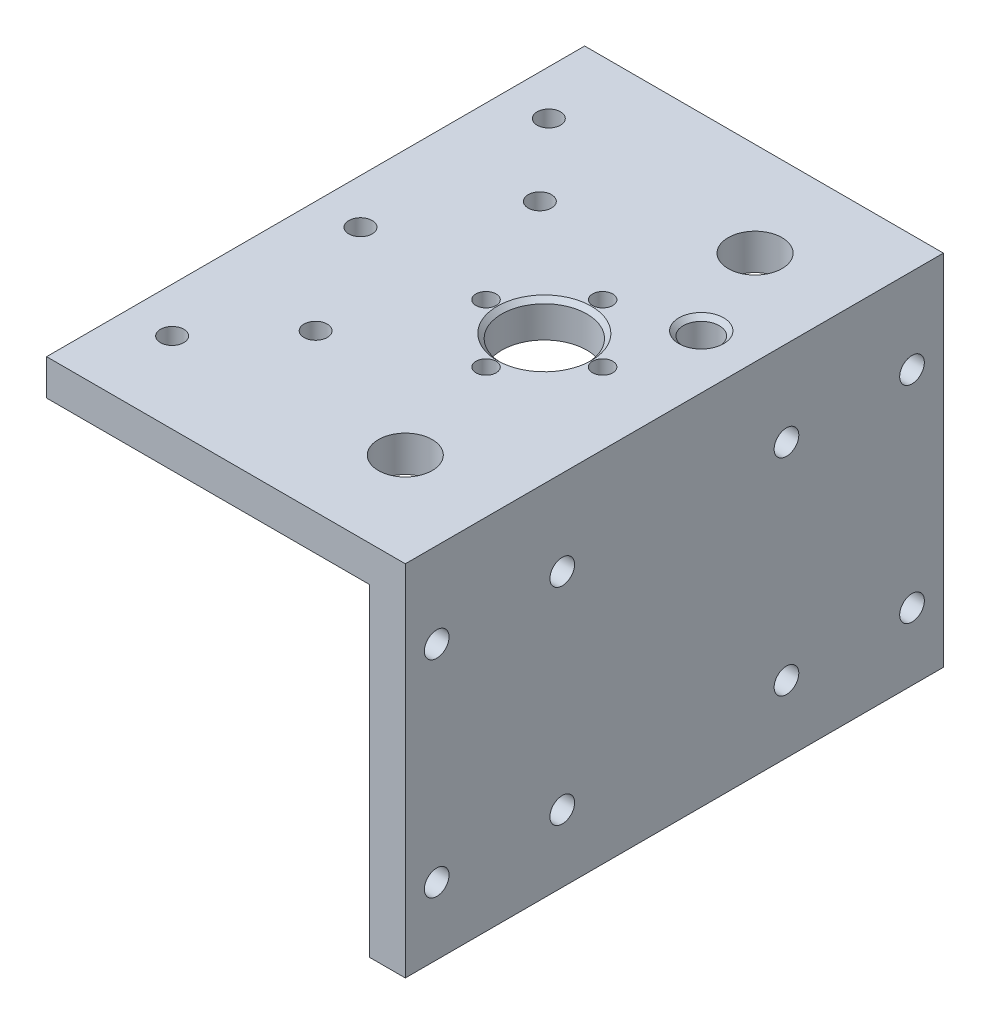
ISO-10303-21;
HEADER;
FILE_DESCRIPTION(('STEP AP214'),'2;1');
FILE_NAME('part.step','',(''),(''),'','','');
FILE_SCHEMA(('AUTOMOTIVE_DESIGN { 1 0 10303 214 1 1 1 1 }'));
ENDSEC;
DATA;
#1=APPLICATION_CONTEXT('core data for automotive mechanical design processes');
#2=APPLICATION_PROTOCOL_DEFINITION('international standard','automotive_design',2000,#1);
#3=PRODUCT_CONTEXT('',#1,'mechanical');
#4=PRODUCT('Part','Part','',(#3));
#5=PRODUCT_RELATED_PRODUCT_CATEGORY('part','',(#4));
#6=PRODUCT_DEFINITION_FORMATION('','',#4);
#7=PRODUCT_DEFINITION_CONTEXT('part definition',#1,'design');
#8=PRODUCT_DEFINITION('design','',#6,#7);
#9=PRODUCT_DEFINITION_SHAPE('','',#8);
#10=(LENGTH_UNIT() NAMED_UNIT(*) SI_UNIT(.MILLI.,.METRE.));
#11=(NAMED_UNIT(*) PLANE_ANGLE_UNIT() SI_UNIT($,.RADIAN.));
#12=(NAMED_UNIT(*) SI_UNIT($,.STERADIAN.) SOLID_ANGLE_UNIT());
#13=UNCERTAINTY_MEASURE_WITH_UNIT(LENGTH_MEASURE(1.E-05),#10,'distance_accuracy_value','');
#14=(GEOMETRIC_REPRESENTATION_CONTEXT(3) GLOBAL_UNCERTAINTY_ASSIGNED_CONTEXT((#13)) GLOBAL_UNIT_ASSIGNED_CONTEXT((#10,
#11,#12)) REPRESENTATION_CONTEXT('',''));
#15=CARTESIAN_POINT('',(0.,0.,0.));
#16=DIRECTION('',(0.,0.,1.));
#17=DIRECTION('',(1.,0.,0.));
#18=AXIS2_PLACEMENT_3D('',#15,#16,#17);
#19=CARTESIAN_POINT('',(0.,-80.,120.));
#20=DIRECTION('',(-1.,0.,0.));
#21=DIRECTION('',(0.,0.,1.));
#22=AXIS2_PLACEMENT_3D('',#19,#20,#21);
#23=PLANE('',#22);
#24=CARTESIAN_POINT('',(0.,-65.,34.9999999999999));
#25=DIRECTION('',(1.,0.,0.));
#26=DIRECTION('',(0.,0.,1.));
#27=AXIS2_PLACEMENT_3D('',#24,#25,#26);
#28=CIRCLE('',#27,2.75);
#29=CARTESIAN_POINT('',(0.,-65.,37.7499999999999));
#30=VERTEX_POINT('',#29);
#31=EDGE_CURVE('E183',#30,#30,#28,.T.);
#32=ORIENTED_EDGE('',*,*,#31,.F.);
#33=EDGE_LOOP('',(#32));
#34=FACE_BOUND('',#33,.T.);
#35=CARTESIAN_POINT('',(0.,-65.,7.00000000000011));
#36=DIRECTION('',(1.,0.,0.));
#37=DIRECTION('',(0.,0.,-1.));
#38=AXIS2_PLACEMENT_3D('',#35,#36,#37);
#39=CIRCLE('',#38,2.75);
#40=CARTESIAN_POINT('',(0.,-65.,4.25000000000011));
#41=VERTEX_POINT('',#40);
#42=EDGE_CURVE('E179',#41,#41,#39,.T.);
#43=ORIENTED_EDGE('',*,*,#42,.F.);
#44=EDGE_LOOP('',(#43));
#45=FACE_BOUND('',#44,.T.);
#46=CARTESIAN_POINT('',(0.,-65.,113.));
#47=DIRECTION('',(1.,0.,0.));
#48=DIRECTION('',(0.,0.,1.));
#49=AXIS2_PLACEMENT_3D('',#46,#47,#48);
#50=CIRCLE('',#49,2.75000000000001);
#51=CARTESIAN_POINT('',(0.,-65.,115.75));
#52=VERTEX_POINT('',#51);
#53=EDGE_CURVE('E175',#52,#52,#50,.T.);
#54=ORIENTED_EDGE('',*,*,#53,.F.);
#55=EDGE_LOOP('',(#54));
#56=FACE_BOUND('',#55,.T.);
#57=CARTESIAN_POINT('',(0.,-65.,85.0000000000001));
#58=DIRECTION('',(1.,0.,0.));
#59=DIRECTION('',(0.,0.,-1.));
#60=AXIS2_PLACEMENT_3D('',#57,#58,#59);
#61=CIRCLE('',#60,2.75000000000001);
#62=CARTESIAN_POINT('',(0.,-65.,82.2500000000001));
#63=VERTEX_POINT('',#62);
#64=EDGE_CURVE('E171',#63,#63,#61,.T.);
#65=ORIENTED_EDGE('',*,*,#64,.F.);
#66=EDGE_LOOP('',(#65));
#67=FACE_BOUND('',#66,.T.);
#68=CARTESIAN_POINT('',(0.,-19.,7.00000000000001));
#69=DIRECTION('',(1.,0.,0.));
#70=DIRECTION('',(0.,0.,1.));
#71=AXIS2_PLACEMENT_3D('',#68,#69,#70);
#72=CIRCLE('',#71,2.75);
#73=CARTESIAN_POINT('',(0.,-19.,9.75));
#74=VERTEX_POINT('',#73);
#75=EDGE_CURVE('E167',#74,#74,#72,.T.);
#76=ORIENTED_EDGE('',*,*,#75,.F.);
#77=EDGE_LOOP('',(#76));
#78=FACE_BOUND('',#77,.T.);
#79=CARTESIAN_POINT('',(0.,-19.,35.));
#80=DIRECTION('',(1.,0.,0.));
#81=DIRECTION('',(0.,0.,-1.));
#82=AXIS2_PLACEMENT_3D('',#79,#80,#81);
#83=CIRCLE('',#82,2.74999999999999);
#84=CARTESIAN_POINT('',(0.,-19.,32.25));
#85=VERTEX_POINT('',#84);
#86=EDGE_CURVE('E163',#85,#85,#83,.T.);
#87=ORIENTED_EDGE('',*,*,#86,.F.);
#88=EDGE_LOOP('',(#87));
#89=FACE_BOUND('',#88,.T.);
#90=CARTESIAN_POINT('',(0.,-19.,113.));
#91=DIRECTION('',(1.,0.,0.));
#92=DIRECTION('',(0.,0.,-1.));
#93=AXIS2_PLACEMENT_3D('',#90,#91,#92);
#94=CIRCLE('',#93,2.75000000000001);
#95=CARTESIAN_POINT('',(0.,-19.,110.25));
#96=VERTEX_POINT('',#95);
#97=EDGE_CURVE('E159',#96,#96,#94,.T.);
#98=ORIENTED_EDGE('',*,*,#97,.F.);
#99=EDGE_LOOP('',(#98));
#100=FACE_BOUND('',#99,.T.);
#101=CARTESIAN_POINT('',(0.,-19.,85.));
#102=DIRECTION('',(1.,0.,0.));
#103=DIRECTION('',(0.,0.,1.));
#104=AXIS2_PLACEMENT_3D('',#101,#102,#103);
#105=CIRCLE('',#104,2.75000000000001);
#106=CARTESIAN_POINT('',(0.,-19.,87.75));
#107=VERTEX_POINT('',#106);
#108=EDGE_CURVE('E155',#107,#107,#105,.T.);
#109=ORIENTED_EDGE('',*,*,#108,.F.);
#110=EDGE_LOOP('',(#109));
#111=FACE_BOUND('',#110,.T.);
#112=DIRECTION('',(0.,1.,0.));
#113=VECTOR('',#112,1.);
#114=CARTESIAN_POINT('',(0.,-80.,0.));
#115=LINE('',#114,#113);
#116=CARTESIAN_POINT('',(0.,-80.,0.));
#117=VERTEX_POINT('',#116);
#118=CARTESIAN_POINT('',(0.,0.,0.));
#119=VERTEX_POINT('',#118);
#120=EDGE_CURVE('E123',#117,#119,#115,.T.);
#121=ORIENTED_EDGE('',*,*,#120,.T.);
#122=DIRECTION('',(0.,0.,-1.));
#123=VECTOR('',#122,1.);
#124=CARTESIAN_POINT('',(0.,0.,120.));
#125=LINE('',#124,#123);
#126=CARTESIAN_POINT('',(0.,0.,120.));
#127=VERTEX_POINT('',#126);
#128=EDGE_CURVE('E144',#127,#119,#125,.T.);
#129=ORIENTED_EDGE('',*,*,#128,.F.);
#130=DIRECTION('',(0.,1.,0.));
#131=VECTOR('',#130,1.);
#132=CARTESIAN_POINT('',(0.,-80.,120.));
#133=LINE('',#132,#131);
#134=CARTESIAN_POINT('',(0.,-80.,120.));
#135=VERTEX_POINT('',#134);
#136=EDGE_CURVE('E137',#135,#127,#133,.T.);
#137=ORIENTED_EDGE('',*,*,#136,.F.);
#138=DIRECTION('',(0.,0.,-1.));
#139=VECTOR('',#138,1.);
#140=CARTESIAN_POINT('',(0.,-80.,120.));
#141=LINE('',#140,#139);
#142=EDGE_CURVE('E119',#135,#117,#141,.T.);
#143=ORIENTED_EDGE('',*,*,#142,.T.);
#144=EDGE_LOOP('',(#121,#129,#137,#143));
#145=FACE_BOUND('',#144,.T.);
#146=ADVANCED_FACE('F33',(#34,#45,#56,#67,#78,#89,#100,#111,#145),#23,.F.);
#147=CARTESIAN_POINT('',(0.,0.,120.));
#148=DIRECTION('',(0.,-1.,0.));
#149=DIRECTION('',(1.,0.,0.));
#150=AXIS2_PLACEMENT_3D('',#147,#148,#149);
#151=PLANE('',#150);
#152=CARTESIAN_POINT('',(-29.,0.,60.));
#153=DIRECTION('',(0.,-1.,0.));
#154=DIRECTION('',(1.,0.,0.));
#155=AXIS2_PLACEMENT_3D('',#152,#153,#154);
#156=CIRCLE('',#155,10.5);
#157=CARTESIAN_POINT('',(-18.5,0.,60.));
#158=VERTEX_POINT('',#157);
#159=EDGE_CURVE('E11',#158,#158,#156,.T.);
#160=ORIENTED_EDGE('',*,*,#159,.T.);
#161=EDGE_LOOP('',(#160));
#162=FACE_BOUND('',#161,.T.);
#163=CARTESIAN_POINT('',(-12.,0.,42.));
#164=DIRECTION('',(0.,-1.,0.));
#165=DIRECTION('',(1.,0.,0.));
#166=AXIS2_PLACEMENT_3D('',#163,#164,#165);
#167=CIRCLE('',#166,5.00000000000003);
#168=CARTESIAN_POINT('',(-6.99999999999997,0.,42.));
#169=VERTEX_POINT('',#168);
#170=EDGE_CURVE('E206',#169,#169,#167,.T.);
#171=ORIENTED_EDGE('',*,*,#170,.T.);
#172=EDGE_LOOP('',(#171));
#173=FACE_BOUND('',#172,.T.);
#174=CARTESIAN_POINT('',(-55.,0.,85.));
#175=DIRECTION('',(0.,1.,0.));
#176=DIRECTION('',(-1.,0.,0.));
#177=AXIS2_PLACEMENT_3D('',#174,#175,#176);
#178=CIRCLE('',#177,2.6);
#179=CARTESIAN_POINT('',(-57.6,0.,85.));
#180=VERTEX_POINT('',#179);
#181=EDGE_CURVE('E203',#180,#180,#178,.T.);
#182=ORIENTED_EDGE('',*,*,#181,.F.);
#183=EDGE_LOOP('',(#182));
#184=FACE_BOUND('',#183,.T.);
#185=CARTESIAN_POINT('',(-55.,0.,35.));
#186=DIRECTION('',(0.,1.,0.));
#187=DIRECTION('',(-1.,0.,0.));
#188=AXIS2_PLACEMENT_3D('',#185,#186,#187);
#189=CIRCLE('',#188,2.6);
#190=CARTESIAN_POINT('',(-57.6,0.,35.));
#191=VERTEX_POINT('',#190);
#192=EDGE_CURVE('E199',#191,#191,#189,.T.);
#193=ORIENTED_EDGE('',*,*,#192,.F.);
#194=EDGE_LOOP('',(#193));
#195=FACE_BOUND('',#194,.T.);
#196=CARTESIAN_POINT('',(-70.,0.,102.));
#197=DIRECTION('',(0.,1.,0.));
#198=DIRECTION('',(-1.,0.,0.));
#199=AXIS2_PLACEMENT_3D('',#196,#197,#198);
#200=CIRCLE('',#199,2.6);
#201=CARTESIAN_POINT('',(-72.6,0.,102.));
#202=VERTEX_POINT('',#201);
#203=EDGE_CURVE('E195',#202,#202,#200,.T.);
#204=ORIENTED_EDGE('',*,*,#203,.F.);
#205=EDGE_LOOP('',(#204));
#206=FACE_BOUND('',#205,.T.);
#207=CARTESIAN_POINT('',(-70.,0.,60.));
#208=DIRECTION('',(0.,1.,0.));
#209=DIRECTION('',(-1.,0.,0.));
#210=AXIS2_PLACEMENT_3D('',#207,#208,#209);
#211=CIRCLE('',#210,2.6);
#212=CARTESIAN_POINT('',(-72.6,0.,60.));
#213=VERTEX_POINT('',#212);
#214=EDGE_CURVE('E191',#213,#213,#211,.T.);
#215=ORIENTED_EDGE('',*,*,#214,.F.);
#216=EDGE_LOOP('',(#215));
#217=FACE_BOUND('',#216,.T.);
#218=CARTESIAN_POINT('',(-70.,0.,18.));
#219=DIRECTION('',(0.,1.,0.));
#220=DIRECTION('',(-1.,0.,0.));
#221=AXIS2_PLACEMENT_3D('',#218,#219,#220);
#222=CIRCLE('',#221,2.6);
#223=CARTESIAN_POINT('',(-72.6,0.,18.));
#224=VERTEX_POINT('',#223);
#225=EDGE_CURVE('E187',#224,#224,#222,.T.);
#226=ORIENTED_EDGE('',*,*,#225,.F.);
#227=EDGE_LOOP('',(#226));
#228=FACE_BOUND('',#227,.T.);
#229=CARTESIAN_POINT('',(-29.,0.,47.));
#230=DIRECTION('',(0.,1.,0.));
#231=DIRECTION('',(0.,0.,1.));
#232=AXIS2_PLACEMENT_3D('',#229,#230,#231);
#233=CIRCLE('',#232,2.24999999999999);
#234=CARTESIAN_POINT('',(-29.,0.,49.25));
#235=VERTEX_POINT('',#234);
#236=EDGE_CURVE('E151',#235,#235,#233,.T.);
#237=ORIENTED_EDGE('',*,*,#236,.F.);
#238=EDGE_LOOP('',(#237));
#239=FACE_BOUND('',#238,.T.);
#240=CARTESIAN_POINT('',(-42.,0.,60.));
#241=DIRECTION('',(0.,1.,0.));
#242=DIRECTION('',(0.,0.,1.));
#243=AXIS2_PLACEMENT_3D('',#240,#241,#242);
#244=CIRCLE('',#243,2.24999999999999);
#245=CARTESIAN_POINT('',(-42.,0.,62.25));
#246=VERTEX_POINT('',#245);
#247=EDGE_CURVE('E150',#246,#246,#244,.T.);
#248=ORIENTED_EDGE('',*,*,#247,.F.);
#249=EDGE_LOOP('',(#248));
#250=FACE_BOUND('',#249,.T.);
#251=CARTESIAN_POINT('',(-29.,0.,73.));
#252=DIRECTION('',(0.,1.,0.));
#253=DIRECTION('',(0.,0.,1.));
#254=AXIS2_PLACEMENT_3D('',#251,#252,#253);
#255=CIRCLE('',#254,2.24999999999999);
#256=CARTESIAN_POINT('',(-29.,0.,75.25));
#257=VERTEX_POINT('',#256);
#258=EDGE_CURVE('E399',#257,#257,#255,.T.);
#259=ORIENTED_EDGE('',*,*,#258,.F.);
#260=EDGE_LOOP('',(#259));
#261=FACE_BOUND('',#260,.T.);
#262=CARTESIAN_POINT('',(-16.,0.,60.));
#263=DIRECTION('',(0.,1.,0.));
#264=DIRECTION('',(0.,0.,1.));
#265=AXIS2_PLACEMENT_3D('',#262,#263,#264);
#266=CIRCLE('',#265,2.24999999999999);
#267=CARTESIAN_POINT('',(-16.,0.,62.25));
#268=VERTEX_POINT('',#267);
#269=EDGE_CURVE('E395',#268,#268,#266,.T.);
#270=ORIENTED_EDGE('',*,*,#269,.F.);
#271=EDGE_LOOP('',(#270));
#272=FACE_BOUND('',#271,.T.);
#273=CARTESIAN_POINT('',(-21.,0.,99.));
#274=DIRECTION('',(0.,1.,0.));
#275=DIRECTION('',(-1.,0.,0.));
#276=AXIS2_PLACEMENT_3D('',#273,#274,#275);
#277=CIRCLE('',#276,6.);
#278=CARTESIAN_POINT('',(-27.,0.,99.));
#279=VERTEX_POINT('',#278);
#280=EDGE_CURVE('E389',#279,#279,#277,.T.);
#281=ORIENTED_EDGE('',*,*,#280,.F.);
#282=EDGE_LOOP('',(#281));
#283=FACE_BOUND('',#282,.T.);
#284=CARTESIAN_POINT('',(-21.,0.,21.));
#285=DIRECTION('',(0.,1.,0.));
#286=DIRECTION('',(-1.,0.,0.));
#287=AXIS2_PLACEMENT_3D('',#284,#285,#286);
#288=CIRCLE('',#287,6.);
#289=CARTESIAN_POINT('',(-27.,0.,21.));
#290=VERTEX_POINT('',#289);
#291=EDGE_CURVE('E374',#290,#290,#288,.T.);
#292=ORIENTED_EDGE('',*,*,#291,.F.);
#293=EDGE_LOOP('',(#292));
#294=FACE_BOUND('',#293,.T.);
#295=DIRECTION('',(-1.,0.,0.));
#296=VECTOR('',#295,1.);
#297=CARTESIAN_POINT('',(0.,0.,0.));
#298=LINE('',#297,#296);
#299=CARTESIAN_POINT('',(-80.,0.,0.));
#300=VERTEX_POINT('',#299);
#301=EDGE_CURVE('E126',#119,#300,#298,.T.);
#302=ORIENTED_EDGE('',*,*,#301,.T.);
#303=DIRECTION('',(0.,0.,-1.));
#304=VECTOR('',#303,1.);
#305=CARTESIAN_POINT('',(-80.,0.,120.));
#306=LINE('',#305,#304);
#307=CARTESIAN_POINT('',(-80.,0.,120.));
#308=VERTEX_POINT('',#307);
#309=EDGE_CURVE('E141',#308,#300,#306,.T.);
#310=ORIENTED_EDGE('',*,*,#309,.F.);
#311=DIRECTION('',(-1.,0.,0.));
#312=VECTOR('',#311,1.);
#313=CARTESIAN_POINT('',(0.,0.,120.));
#314=LINE('',#313,#312);
#315=EDGE_CURVE('E89',#127,#308,#314,.T.);
#316=ORIENTED_EDGE('',*,*,#315,.F.);
#317=ORIENTED_EDGE('',*,*,#128,.T.);
#318=EDGE_LOOP('',(#302,#310,#316,#317));
#319=FACE_BOUND('',#318,.T.);
#320=ADVANCED_FACE('F224',(#162,#173,#184,#195,#206,#217,#228,#239,#250,#261,#272,#283,#294,
#319),#151,.F.);
#321=CARTESIAN_POINT('',(-80.,0.,120.));
#322=DIRECTION('',(1.,0.,0.));
#323=DIRECTION('',(0.,0.,-1.));
#324=AXIS2_PLACEMENT_3D('',#321,#322,#323);
#325=PLANE('',#324);
#326=DIRECTION('',(0.,-1.,0.));
#327=VECTOR('',#326,1.);
#328=CARTESIAN_POINT('',(-80.,0.,0.));
#329=LINE('',#328,#327);
#330=CARTESIAN_POINT('',(-80.,-8.00000000000001,0.));
#331=VERTEX_POINT('',#330);
#332=EDGE_CURVE('E129',#300,#331,#329,.T.);
#333=ORIENTED_EDGE('',*,*,#332,.T.);
#334=DIRECTION('',(0.,0.,-1.));
#335=VECTOR('',#334,1.);
#336=CARTESIAN_POINT('',(-80.,-8.00000000000001,120.));
#337=LINE('',#336,#335);
#338=CARTESIAN_POINT('',(-80.,-8.00000000000001,120.));
#339=VERTEX_POINT('',#338);
#340=EDGE_CURVE('E113',#339,#331,#337,.T.);
#341=ORIENTED_EDGE('',*,*,#340,.F.);
#342=DIRECTION('',(0.,-1.,0.));
#343=VECTOR('',#342,1.);
#344=CARTESIAN_POINT('',(-80.,0.,120.));
#345=LINE('',#344,#343);
#346=EDGE_CURVE('E103',#308,#339,#345,.T.);
#347=ORIENTED_EDGE('',*,*,#346,.F.);
#348=ORIENTED_EDGE('',*,*,#309,.T.);
#349=EDGE_LOOP('',(#333,#341,#347,#348));
#350=FACE_BOUND('',#349,.T.);
#351=ADVANCED_FACE('F230',(#350),#325,.F.);
#352=CARTESIAN_POINT('',(-80.,-8.00000000000001,120.));
#353=DIRECTION('',(0.,1.,0.));
#354=DIRECTION('',(0.,0.,1.));
#355=AXIS2_PLACEMENT_3D('',#352,#353,#354);
#356=PLANE('',#355);
#357=CARTESIAN_POINT('',(-55.,-8.00000000000001,85.));
#358=DIRECTION('',(0.,1.,0.));
#359=DIRECTION('',(0.,0.,1.));
#360=AXIS2_PLACEMENT_3D('',#357,#358,#359);
#361=CIRCLE('',#360,2.6);
#362=CARTESIAN_POINT('',(-55.,-8.00000000000001,87.6));
#363=VERTEX_POINT('',#362);
#364=EDGE_CURVE('E200',#363,#363,#361,.T.);
#365=ORIENTED_EDGE('',*,*,#364,.T.);
#366=EDGE_LOOP('',(#365));
#367=FACE_BOUND('',#366,.T.);
#368=CARTESIAN_POINT('',(-55.,-8.00000000000001,35.));
#369=DIRECTION('',(0.,1.,0.));
#370=DIRECTION('',(0.,0.,1.));
#371=AXIS2_PLACEMENT_3D('',#368,#369,#370);
#372=CIRCLE('',#371,2.6);
#373=CARTESIAN_POINT('',(-55.,-8.00000000000001,37.6));
#374=VERTEX_POINT('',#373);
#375=EDGE_CURVE('E196',#374,#374,#372,.T.);
#376=ORIENTED_EDGE('',*,*,#375,.T.);
#377=EDGE_LOOP('',(#376));
#378=FACE_BOUND('',#377,.T.);
#379=CARTESIAN_POINT('',(-70.,-8.00000000000001,102.));
#380=DIRECTION('',(0.,1.,0.));
#381=DIRECTION('',(0.,0.,1.));
#382=AXIS2_PLACEMENT_3D('',#379,#380,#381);
#383=CIRCLE('',#382,2.6);
#384=CARTESIAN_POINT('',(-70.,-8.00000000000001,104.6));
#385=VERTEX_POINT('',#384);
#386=EDGE_CURVE('E192',#385,#385,#383,.T.);
#387=ORIENTED_EDGE('',*,*,#386,.T.);
#388=EDGE_LOOP('',(#387));
#389=FACE_BOUND('',#388,.T.);
#390=CARTESIAN_POINT('',(-70.,-8.00000000000001,60.));
#391=DIRECTION('',(0.,1.,0.));
#392=DIRECTION('',(0.,0.,1.));
#393=AXIS2_PLACEMENT_3D('',#390,#391,#392);
#394=CIRCLE('',#393,2.6);
#395=CARTESIAN_POINT('',(-70.,-8.00000000000001,62.6));
#396=VERTEX_POINT('',#395);
#397=EDGE_CURVE('E188',#396,#396,#394,.T.);
#398=ORIENTED_EDGE('',*,*,#397,.T.);
#399=EDGE_LOOP('',(#398));
#400=FACE_BOUND('',#399,.T.);
#401=CARTESIAN_POINT('',(-70.,-8.00000000000001,18.));
#402=DIRECTION('',(0.,1.,0.));
#403=DIRECTION('',(0.,0.,1.));
#404=AXIS2_PLACEMENT_3D('',#401,#402,#403);
#405=CIRCLE('',#404,2.6);
#406=CARTESIAN_POINT('',(-70.,-8.00000000000001,20.6));
#407=VERTEX_POINT('',#406);
#408=EDGE_CURVE('E184',#407,#407,#405,.T.);
#409=ORIENTED_EDGE('',*,*,#408,.T.);
#410=EDGE_LOOP('',(#409));
#411=FACE_BOUND('',#410,.T.);
#412=CARTESIAN_POINT('',(-29.,-8.00000000000001,47.));
#413=DIRECTION('',(0.,1.,0.));
#414=DIRECTION('',(0.,0.,1.));
#415=AXIS2_PLACEMENT_3D('',#412,#413,#414);
#416=CIRCLE('',#415,2.24999999999999);
#417=CARTESIAN_POINT('',(-29.,-8.00000000000001,49.25));
#418=VERTEX_POINT('',#417);
#419=EDGE_CURVE('E147',#418,#418,#416,.T.);
#420=ORIENTED_EDGE('',*,*,#419,.T.);
#421=EDGE_LOOP('',(#420));
#422=FACE_BOUND('',#421,.T.);
#423=CARTESIAN_POINT('',(-42.,-8.00000000000001,60.));
#424=DIRECTION('',(0.,1.,0.));
#425=DIRECTION('',(0.,0.,1.));
#426=AXIS2_PLACEMENT_3D('',#423,#424,#425);
#427=CIRCLE('',#426,2.24999999999999);
#428=CARTESIAN_POINT('',(-42.,-8.00000000000001,62.25));
#429=VERTEX_POINT('',#428);
#430=EDGE_CURVE('E354',#429,#429,#427,.T.);
#431=ORIENTED_EDGE('',*,*,#430,.T.);
#432=EDGE_LOOP('',(#431));
#433=FACE_BOUND('',#432,.T.);
#434=CARTESIAN_POINT('',(-29.,-8.00000000000001,73.));
#435=DIRECTION('',(0.,1.,0.));
#436=DIRECTION('',(0.,0.,1.));
#437=AXIS2_PLACEMENT_3D('',#434,#435,#436);
#438=CIRCLE('',#437,2.24999999999999);
#439=CARTESIAN_POINT('',(-29.,-8.00000000000001,75.25));
#440=VERTEX_POINT('',#439);
#441=EDGE_CURVE('E358',#440,#440,#438,.T.);
#442=ORIENTED_EDGE('',*,*,#441,.T.);
#443=EDGE_LOOP('',(#442));
#444=FACE_BOUND('',#443,.T.);
#445=CARTESIAN_POINT('',(-16.,-8.00000000000001,60.));
#446=DIRECTION('',(0.,1.,0.));
#447=DIRECTION('',(0.,0.,1.));
#448=AXIS2_PLACEMENT_3D('',#445,#446,#447);
#449=CIRCLE('',#448,2.24999999999999);
#450=CARTESIAN_POINT('',(-16.,-8.00000000000001,62.25));
#451=VERTEX_POINT('',#450);
#452=EDGE_CURVE('E362',#451,#451,#449,.T.);
#453=ORIENTED_EDGE('',*,*,#452,.T.);
#454=EDGE_LOOP('',(#453));
#455=FACE_BOUND('',#454,.T.);
#456=CARTESIAN_POINT('',(-29.,-8.00000000000001,60.));
#457=DIRECTION('',(0.,1.,0.));
#458=DIRECTION('',(0.,0.,1.));
#459=AXIS2_PLACEMENT_3D('',#456,#457,#458);
#460=CIRCLE('',#459,9.5);
#461=CARTESIAN_POINT('',(-29.,-8.00000000000001,69.5));
#462=VERTEX_POINT('',#461);
#463=EDGE_CURVE('E366',#462,#462,#460,.F.);
#464=ORIENTED_EDGE('',*,*,#463,.F.);
#465=EDGE_LOOP('',(#464));
#466=FACE_BOUND('',#465,.T.);
#467=CARTESIAN_POINT('',(-21.,-8.00000000000001,99.));
#468=DIRECTION('',(0.,1.,0.));
#469=DIRECTION('',(0.,0.,1.));
#470=AXIS2_PLACEMENT_3D('',#467,#468,#469);
#471=CIRCLE('',#470,6.);
#472=CARTESIAN_POINT('',(-21.,-8.00000000000001,105.));
#473=VERTEX_POINT('',#472);
#474=EDGE_CURVE('E370',#473,#473,#471,.F.);
#475=ORIENTED_EDGE('',*,*,#474,.F.);
#476=EDGE_LOOP('',(#475));
#477=FACE_BOUND('',#476,.T.);
#478=CARTESIAN_POINT('',(-21.,-8.00000000000001,21.));
#479=DIRECTION('',(0.,1.,0.));
#480=DIRECTION('',(0.,0.,1.));
#481=AXIS2_PLACEMENT_3D('',#478,#479,#480);
#482=CIRCLE('',#481,6.);
#483=CARTESIAN_POINT('',(-21.,-8.00000000000001,27.));
#484=VERTEX_POINT('',#483);
#485=EDGE_CURVE('E127',#484,#484,#482,.F.);
#486=ORIENTED_EDGE('',*,*,#485,.F.);
#487=EDGE_LOOP('',(#486));
#488=FACE_BOUND('',#487,.T.);
#489=DIRECTION('',(0.,0.,-1.));
#490=VECTOR('',#489,1.);
#491=CARTESIAN_POINT('',(-8.00000000000001,-8.00000000000001,120.));
#492=LINE('',#491,#490);
#493=CARTESIAN_POINT('',(-8.00000000000001,-8.00000000000001,42.));
#494=VERTEX_POINT('',#493);
#495=CARTESIAN_POINT('',(-8.00000000000001,-8.00000000000001,0.));
#496=VERTEX_POINT('',#495);
#497=EDGE_CURVE('E114',#494,#496,#492,.T.);
#498=ORIENTED_EDGE('',*,*,#497,.F.);
#499=CARTESIAN_POINT('',(-12.,-8.00000000000001,42.));
#500=DIRECTION('',(0.,1.,0.));
#501=DIRECTION('',(0.,0.,1.));
#502=AXIS2_PLACEMENT_3D('',#499,#500,#501);
#503=CIRCLE('',#502,4.00000000000001);
#504=EDGE_CURVE('E46',#494,#494,#503,.F.);
#505=ORIENTED_EDGE('',*,*,#504,.F.);
#506=CARTESIAN_POINT('',(-8.00000000000001,-8.00000000000001,120.));
#507=VERTEX_POINT('',#506);
#508=EDGE_CURVE('E109',#507,#494,#492,.T.);
#509=ORIENTED_EDGE('',*,*,#508,.F.);
#510=DIRECTION('',(1.,0.,0.));
#511=VECTOR('',#510,1.);
#512=CARTESIAN_POINT('',(-80.,-8.00000000000001,120.));
#513=LINE('',#512,#511);
#514=EDGE_CURVE('E96',#339,#507,#513,.T.);
#515=ORIENTED_EDGE('',*,*,#514,.F.);
#516=ORIENTED_EDGE('',*,*,#340,.T.);
#517=DIRECTION('',(1.,0.,0.));
#518=VECTOR('',#517,1.);
#519=CARTESIAN_POINT('',(-80.,-8.00000000000001,0.));
#520=LINE('',#519,#518);
#521=EDGE_CURVE('E131',#331,#496,#520,.T.);
#522=ORIENTED_EDGE('',*,*,#521,.T.);
#523=EDGE_LOOP('',(#498,#505,#509,#515,#516,#522));
#524=FACE_BOUND('',#523,.T.);
#525=ADVANCED_FACE('F111',(#367,#378,#389,#400,#411,#422,#433,#444,#455,#466,#477,#488,#524),
#356,.F.);
#526=CARTESIAN_POINT('',(-8.00000000000001,-8.00000000000001,120.));
#527=DIRECTION('',(1.,0.,0.));
#528=DIRECTION('',(0.,1.,0.));
#529=AXIS2_PLACEMENT_3D('',#526,#527,#528);
#530=PLANE('',#529);
#531=CARTESIAN_POINT('',(-8.,-65.,34.9999999999999));
#532=DIRECTION('',(1.,0.,0.));
#533=DIRECTION('',(0.,1.,0.));
#534=AXIS2_PLACEMENT_3D('',#531,#532,#533);
#535=CIRCLE('',#534,2.75);
#536=CARTESIAN_POINT('',(-8.,-62.25,34.9999999999999));
#537=VERTEX_POINT('',#536);
#538=EDGE_CURVE('E180',#537,#537,#535,.T.);
#539=ORIENTED_EDGE('',*,*,#538,.T.);
#540=EDGE_LOOP('',(#539));
#541=FACE_BOUND('',#540,.T.);
#542=CARTESIAN_POINT('',(-8.,-65.,7.00000000000011));
#543=DIRECTION('',(1.,0.,0.));
#544=DIRECTION('',(0.,1.,0.));
#545=AXIS2_PLACEMENT_3D('',#542,#543,#544);
#546=CIRCLE('',#545,2.75);
#547=CARTESIAN_POINT('',(-8.,-62.25,7.00000000000011));
#548=VERTEX_POINT('',#547);
#549=EDGE_CURVE('E176',#548,#548,#546,.T.);
#550=ORIENTED_EDGE('',*,*,#549,.T.);
#551=EDGE_LOOP('',(#550));
#552=FACE_BOUND('',#551,.T.);
#553=CARTESIAN_POINT('',(-8.,-65.,113.));
#554=DIRECTION('',(1.,0.,0.));
#555=DIRECTION('',(0.,1.,0.));
#556=AXIS2_PLACEMENT_3D('',#553,#554,#555);
#557=CIRCLE('',#556,2.75000000000001);
#558=CARTESIAN_POINT('',(-8.,-62.25,113.));
#559=VERTEX_POINT('',#558);
#560=EDGE_CURVE('E172',#559,#559,#557,.T.);
#561=ORIENTED_EDGE('',*,*,#560,.T.);
#562=EDGE_LOOP('',(#561));
#563=FACE_BOUND('',#562,.T.);
#564=CARTESIAN_POINT('',(-8.,-65.,85.0000000000001));
#565=DIRECTION('',(1.,0.,0.));
#566=DIRECTION('',(0.,1.,0.));
#567=AXIS2_PLACEMENT_3D('',#564,#565,#566);
#568=CIRCLE('',#567,2.75000000000001);
#569=CARTESIAN_POINT('',(-8.,-62.25,85.0000000000001));
#570=VERTEX_POINT('',#569);
#571=EDGE_CURVE('E168',#570,#570,#568,.T.);
#572=ORIENTED_EDGE('',*,*,#571,.T.);
#573=EDGE_LOOP('',(#572));
#574=FACE_BOUND('',#573,.T.);
#575=CARTESIAN_POINT('',(-8.00000000000001,-19.,7.00000000000001));
#576=DIRECTION('',(1.,0.,0.));
#577=DIRECTION('',(0.,1.,0.));
#578=AXIS2_PLACEMENT_3D('',#575,#576,#577);
#579=CIRCLE('',#578,2.75);
#580=CARTESIAN_POINT('',(-8.00000000000001,-16.25,7.00000000000001));
#581=VERTEX_POINT('',#580);
#582=EDGE_CURVE('E164',#581,#581,#579,.T.);
#583=ORIENTED_EDGE('',*,*,#582,.T.);
#584=EDGE_LOOP('',(#583));
#585=FACE_BOUND('',#584,.T.);
#586=CARTESIAN_POINT('',(-8.00000000000001,-19.,35.));
#587=DIRECTION('',(1.,0.,0.));
#588=DIRECTION('',(0.,1.,0.));
#589=AXIS2_PLACEMENT_3D('',#586,#587,#588);
#590=CIRCLE('',#589,2.74999999999999);
#591=CARTESIAN_POINT('',(-8.00000000000001,-16.25,35.));
#592=VERTEX_POINT('',#591);
#593=EDGE_CURVE('E160',#592,#592,#590,.T.);
#594=ORIENTED_EDGE('',*,*,#593,.T.);
#595=EDGE_LOOP('',(#594));
#596=FACE_BOUND('',#595,.T.);
#597=CARTESIAN_POINT('',(-8.00000000000001,-19.,113.));
#598=DIRECTION('',(1.,0.,0.));
#599=DIRECTION('',(0.,1.,0.));
#600=AXIS2_PLACEMENT_3D('',#597,#598,#599);
#601=CIRCLE('',#600,2.75000000000001);
#602=CARTESIAN_POINT('',(-8.00000000000001,-16.25,113.));
#603=VERTEX_POINT('',#602);
#604=EDGE_CURVE('E156',#603,#603,#601,.T.);
#605=ORIENTED_EDGE('',*,*,#604,.T.);
#606=EDGE_LOOP('',(#605));
#607=FACE_BOUND('',#606,.T.);
#608=CARTESIAN_POINT('',(-8.00000000000001,-19.,85.));
#609=DIRECTION('',(1.,0.,0.));
#610=DIRECTION('',(0.,1.,0.));
#611=AXIS2_PLACEMENT_3D('',#608,#609,#610);
#612=CIRCLE('',#611,2.75000000000001);
#613=CARTESIAN_POINT('',(-8.00000000000001,-16.25,85.));
#614=VERTEX_POINT('',#613);
#615=EDGE_CURVE('E152',#614,#614,#612,.T.);
#616=ORIENTED_EDGE('',*,*,#615,.T.);
#617=EDGE_LOOP('',(#616));
#618=FACE_BOUND('',#617,.T.);
#619=DIRECTION('',(0.,-1.,0.));
#620=VECTOR('',#619,1.);
#621=CARTESIAN_POINT('',(-8.00000000000001,-8.00000000000001,0.));
#622=LINE('',#621,#620);
#623=CARTESIAN_POINT('',(-8.,-80.,0.));
#624=VERTEX_POINT('',#623);
#625=EDGE_CURVE('E134',#496,#624,#622,.T.);
#626=ORIENTED_EDGE('',*,*,#625,.T.);
#627=DIRECTION('',(0.,0.,-1.));
#628=VECTOR('',#627,1.);
#629=CARTESIAN_POINT('',(-8.,-80.,120.));
#630=LINE('',#629,#628);
#631=CARTESIAN_POINT('',(-8.,-80.,120.));
#632=VERTEX_POINT('',#631);
#633=EDGE_CURVE('E117',#632,#624,#630,.T.);
#634=ORIENTED_EDGE('',*,*,#633,.F.);
#635=DIRECTION('',(0.,-1.,0.));
#636=VECTOR('',#635,1.);
#637=CARTESIAN_POINT('',(-8.00000000000001,-8.00000000000001,120.));
#638=LINE('',#637,#636);
#639=EDGE_CURVE('E100',#507,#632,#638,.T.);
#640=ORIENTED_EDGE('',*,*,#639,.F.);
#641=ORIENTED_EDGE('',*,*,#508,.T.);
#642=ORIENTED_EDGE('',*,*,#497,.T.);
#643=EDGE_LOOP('',(#626,#634,#640,#641,#642));
#644=FACE_BOUND('',#643,.T.);
#645=ADVANCED_FACE('F116',(#541,#552,#563,#574,#585,#596,#607,#618,#644),#530,.F.);
#646=CARTESIAN_POINT('',(-8.,-80.,120.));
#647=DIRECTION('',(0.,1.,0.));
#648=DIRECTION('',(0.,0.,1.));
#649=AXIS2_PLACEMENT_3D('',#646,#647,#648);
#650=PLANE('',#649);
#651=DIRECTION('',(1.,0.,0.));
#652=VECTOR('',#651,1.);
#653=CARTESIAN_POINT('',(-8.,-80.,0.));
#654=LINE('',#653,#652);
#655=EDGE_CURVE('E80',#624,#117,#654,.T.);
#656=ORIENTED_EDGE('',*,*,#655,.T.);
#657=ORIENTED_EDGE('',*,*,#142,.F.);
#658=DIRECTION('',(1.,0.,0.));
#659=VECTOR('',#658,1.);
#660=CARTESIAN_POINT('',(-8.,-80.,120.));
#661=LINE('',#660,#659);
#662=EDGE_CURVE('E54',#632,#135,#661,.T.);
#663=ORIENTED_EDGE('',*,*,#662,.F.);
#664=ORIENTED_EDGE('',*,*,#633,.T.);
#665=EDGE_LOOP('',(#656,#657,#663,#664));
#666=FACE_BOUND('',#665,.T.);
#667=ADVANCED_FACE('F244',(#666),#650,.F.);
#668=CARTESIAN_POINT('',(0.,0.,120.));
#669=DIRECTION('',(0.,0.,1.));
#670=DIRECTION('',(1.,0.,0.));
#671=AXIS2_PLACEMENT_3D('',#668,#669,#670);
#672=PLANE('',#671);
#673=ORIENTED_EDGE('',*,*,#136,.T.);
#674=ORIENTED_EDGE('',*,*,#315,.T.);
#675=ORIENTED_EDGE('',*,*,#346,.T.);
#676=ORIENTED_EDGE('',*,*,#514,.T.);
#677=ORIENTED_EDGE('',*,*,#639,.T.);
#678=ORIENTED_EDGE('',*,*,#662,.T.);
#679=EDGE_LOOP('',(#673,#674,#675,#676,#677,#678));
#680=FACE_BOUND('',#679,.T.);
#681=ADVANCED_FACE('F98',(#680),#672,.T.);
#682=CARTESIAN_POINT('',(0.,0.,0.));
#683=DIRECTION('',(0.,0.,1.));
#684=DIRECTION('',(1.,0.,0.));
#685=AXIS2_PLACEMENT_3D('',#682,#683,#684);
#686=PLANE('',#685);
#687=ORIENTED_EDGE('',*,*,#120,.F.);
#688=ORIENTED_EDGE('',*,*,#655,.F.);
#689=ORIENTED_EDGE('',*,*,#625,.F.);
#690=ORIENTED_EDGE('',*,*,#521,.F.);
#691=ORIENTED_EDGE('',*,*,#332,.F.);
#692=ORIENTED_EDGE('',*,*,#301,.F.);
#693=EDGE_LOOP('',(#687,#688,#689,#690,#691,#692));
#694=FACE_BOUND('',#693,.T.);
#695=ADVANCED_FACE('F248',(#694),#686,.F.);
#696=CARTESIAN_POINT('',(-21.,-80.001,21.));
#697=DIRECTION('',(0.,1.,0.));
#698=DIRECTION('',(-1.,0.,0.));
#699=AXIS2_PLACEMENT_3D('',#696,#697,#698);
#700=CYLINDRICAL_SURFACE('',#699,6.);
#701=ORIENTED_EDGE('',*,*,#291,.T.);
#702=EDGE_LOOP('',(#701));
#703=FACE_BOUND('',#702,.T.);
#704=ORIENTED_EDGE('',*,*,#485,.T.);
#705=EDGE_LOOP('',(#704));
#706=FACE_BOUND('',#705,.T.);
#707=ADVANCED_FACE('F251',(#703,#706),#700,.F.);
#708=CARTESIAN_POINT('',(-21.,-80.001,99.));
#709=DIRECTION('',(0.,1.,0.));
#710=DIRECTION('',(-1.,0.,0.));
#711=AXIS2_PLACEMENT_3D('',#708,#709,#710);
#712=CYLINDRICAL_SURFACE('',#711,6.);
#713=ORIENTED_EDGE('',*,*,#280,.T.);
#714=EDGE_LOOP('',(#713));
#715=FACE_BOUND('',#714,.T.);
#716=ORIENTED_EDGE('',*,*,#474,.T.);
#717=EDGE_LOOP('',(#716));
#718=FACE_BOUND('',#717,.T.);
#719=ADVANCED_FACE('F257',(#715,#718),#712,.F.);
#720=CARTESIAN_POINT('',(-29.,-80.001,60.));
#721=DIRECTION('',(0.,1.,0.));
#722=DIRECTION('',(-1.,0.,0.));
#723=AXIS2_PLACEMENT_3D('',#720,#721,#722);
#724=CYLINDRICAL_SURFACE('',#723,9.5);
#725=CARTESIAN_POINT('',(-29.,-1.00000000000003,60.));
#726=DIRECTION('',(0.,-1.,0.));
#727=DIRECTION('',(0.,0.,-1.));
#728=AXIS2_PLACEMENT_3D('',#725,#726,#727);
#729=CIRCLE('',#728,9.5);
#730=CARTESIAN_POINT('',(-29.,-1.00000000000003,50.5));
#731=VERTEX_POINT('',#730);
#732=EDGE_CURVE('E41',#731,#731,#729,.F.);
#733=ORIENTED_EDGE('',*,*,#732,.T.);
#734=EDGE_LOOP('',(#733));
#735=FACE_BOUND('',#734,.T.);
#736=ORIENTED_EDGE('',*,*,#463,.T.);
#737=EDGE_LOOP('',(#736));
#738=FACE_BOUND('',#737,.T.);
#739=ADVANCED_FACE('F211',(#735,#738),#724,.F.);
#740=CARTESIAN_POINT('',(-12.,-80.001,42.));
#741=DIRECTION('',(0.,1.,0.));
#742=DIRECTION('',(-1.,0.,0.));
#743=AXIS2_PLACEMENT_3D('',#740,#741,#742);
#744=CYLINDRICAL_SURFACE('',#743,4.00000000000001);
#745=CARTESIAN_POINT('',(-12.,-1.00000000000003,42.));
#746=DIRECTION('',(0.,-1.,0.));
#747=DIRECTION('',(0.,0.,-1.));
#748=AXIS2_PLACEMENT_3D('',#745,#746,#747);
#749=CIRCLE('',#748,4.00000000000001);
#750=CARTESIAN_POINT('',(-12.,-1.00000000000003,38.));
#751=VERTEX_POINT('',#750);
#752=EDGE_CURVE('E146',#751,#751,#749,.F.);
#753=ORIENTED_EDGE('',*,*,#752,.T.);
#754=EDGE_LOOP('',(#753));
#755=FACE_BOUND('',#754,.T.);
#756=ORIENTED_EDGE('',*,*,#504,.T.);
#757=EDGE_LOOP('',(#756));
#758=FACE_BOUND('',#757,.T.);
#759=ADVANCED_FACE('F264',(#755,#758),#744,.F.);
#760=CARTESIAN_POINT('',(-16.,0.,60.));
#761=DIRECTION('',(0.,1.,0.));
#762=DIRECTION('',(0.,0.,1.));
#763=AXIS2_PLACEMENT_3D('',#760,#761,#762);
#764=CYLINDRICAL_SURFACE('',#763,2.24999999999999);
#765=ORIENTED_EDGE('',*,*,#269,.T.);
#766=EDGE_LOOP('',(#765));
#767=FACE_BOUND('',#766,.T.);
#768=ORIENTED_EDGE('',*,*,#452,.F.);
#769=EDGE_LOOP('',(#768));
#770=FACE_BOUND('',#769,.T.);
#771=ADVANCED_FACE('F267',(#767,#770),#764,.F.);
#772=CARTESIAN_POINT('',(-29.,0.,73.));
#773=DIRECTION('',(0.,1.,0.));
#774=DIRECTION('',(0.,0.,1.));
#775=AXIS2_PLACEMENT_3D('',#772,#773,#774);
#776=CYLINDRICAL_SURFACE('',#775,2.24999999999999);
#777=ORIENTED_EDGE('',*,*,#258,.T.);
#778=EDGE_LOOP('',(#777));
#779=FACE_BOUND('',#778,.T.);
#780=ORIENTED_EDGE('',*,*,#441,.F.);
#781=EDGE_LOOP('',(#780));
#782=FACE_BOUND('',#781,.T.);
#783=ADVANCED_FACE('F271',(#779,#782),#776,.F.);
#784=CARTESIAN_POINT('',(-42.,0.,60.));
#785=DIRECTION('',(0.,1.,0.));
#786=DIRECTION('',(0.,0.,1.));
#787=AXIS2_PLACEMENT_3D('',#784,#785,#786);
#788=CYLINDRICAL_SURFACE('',#787,2.24999999999999);
#789=ORIENTED_EDGE('',*,*,#247,.T.);
#790=EDGE_LOOP('',(#789));
#791=FACE_BOUND('',#790,.T.);
#792=ORIENTED_EDGE('',*,*,#430,.F.);
#793=EDGE_LOOP('',(#792));
#794=FACE_BOUND('',#793,.T.);
#795=ADVANCED_FACE('F275',(#791,#794),#788,.F.);
#796=CARTESIAN_POINT('',(-29.,0.,47.));
#797=DIRECTION('',(0.,1.,0.));
#798=DIRECTION('',(0.,0.,1.));
#799=AXIS2_PLACEMENT_3D('',#796,#797,#798);
#800=CYLINDRICAL_SURFACE('',#799,2.24999999999999);
#801=ORIENTED_EDGE('',*,*,#236,.T.);
#802=EDGE_LOOP('',(#801));
#803=FACE_BOUND('',#802,.T.);
#804=ORIENTED_EDGE('',*,*,#419,.F.);
#805=EDGE_LOOP('',(#804));
#806=FACE_BOUND('',#805,.T.);
#807=ADVANCED_FACE('F279',(#803,#806),#800,.F.);
#808=CARTESIAN_POINT('',(-10.,-19.,85.));
#809=DIRECTION('',(1.,0.,0.));
#810=DIRECTION('',(0.,0.,-1.));
#811=AXIS2_PLACEMENT_3D('',#808,#809,#810);
#812=CYLINDRICAL_SURFACE('',#811,2.75000000000001);
#813=ORIENTED_EDGE('',*,*,#108,.T.);
#814=EDGE_LOOP('',(#813));
#815=FACE_BOUND('',#814,.T.);
#816=ORIENTED_EDGE('',*,*,#615,.F.);
#817=EDGE_LOOP('',(#816));
#818=FACE_BOUND('',#817,.T.);
#819=ADVANCED_FACE('F283',(#815,#818),#812,.F.);
#820=CARTESIAN_POINT('',(-10.,-19.,113.));
#821=DIRECTION('',(1.,0.,0.));
#822=DIRECTION('',(0.,0.,-1.));
#823=AXIS2_PLACEMENT_3D('',#820,#821,#822);
#824=CYLINDRICAL_SURFACE('',#823,2.75000000000001);
#825=ORIENTED_EDGE('',*,*,#97,.T.);
#826=EDGE_LOOP('',(#825));
#827=FACE_BOUND('',#826,.T.);
#828=ORIENTED_EDGE('',*,*,#604,.F.);
#829=EDGE_LOOP('',(#828));
#830=FACE_BOUND('',#829,.T.);
#831=ADVANCED_FACE('F287',(#827,#830),#824,.F.);
#832=CARTESIAN_POINT('',(-10.,-19.,35.));
#833=DIRECTION('',(1.,0.,0.));
#834=DIRECTION('',(0.,0.,-1.));
#835=AXIS2_PLACEMENT_3D('',#832,#833,#834);
#836=CYLINDRICAL_SURFACE('',#835,2.74999999999999);
#837=ORIENTED_EDGE('',*,*,#86,.T.);
#838=EDGE_LOOP('',(#837));
#839=FACE_BOUND('',#838,.T.);
#840=ORIENTED_EDGE('',*,*,#593,.F.);
#841=EDGE_LOOP('',(#840));
#842=FACE_BOUND('',#841,.T.);
#843=ADVANCED_FACE('F291',(#839,#842),#836,.F.);
#844=CARTESIAN_POINT('',(-10.,-19.,7.00000000000001));
#845=DIRECTION('',(1.,0.,0.));
#846=DIRECTION('',(0.,0.,-1.));
#847=AXIS2_PLACEMENT_3D('',#844,#845,#846);
#848=CYLINDRICAL_SURFACE('',#847,2.75);
#849=ORIENTED_EDGE('',*,*,#75,.T.);
#850=EDGE_LOOP('',(#849));
#851=FACE_BOUND('',#850,.T.);
#852=ORIENTED_EDGE('',*,*,#582,.F.);
#853=EDGE_LOOP('',(#852));
#854=FACE_BOUND('',#853,.T.);
#855=ADVANCED_FACE('F295',(#851,#854),#848,.F.);
#856=CARTESIAN_POINT('',(-10.,-65.,85.0000000000001));
#857=DIRECTION('',(1.,0.,0.));
#858=DIRECTION('',(0.,0.,-1.));
#859=AXIS2_PLACEMENT_3D('',#856,#857,#858);
#860=CYLINDRICAL_SURFACE('',#859,2.75000000000001);
#861=ORIENTED_EDGE('',*,*,#64,.T.);
#862=EDGE_LOOP('',(#861));
#863=FACE_BOUND('',#862,.T.);
#864=ORIENTED_EDGE('',*,*,#571,.F.);
#865=EDGE_LOOP('',(#864));
#866=FACE_BOUND('',#865,.T.);
#867=ADVANCED_FACE('F299',(#863,#866),#860,.F.);
#868=CARTESIAN_POINT('',(-10.,-65.,113.));
#869=DIRECTION('',(1.,0.,0.));
#870=DIRECTION('',(0.,0.,-1.));
#871=AXIS2_PLACEMENT_3D('',#868,#869,#870);
#872=CYLINDRICAL_SURFACE('',#871,2.75000000000001);
#873=ORIENTED_EDGE('',*,*,#53,.T.);
#874=EDGE_LOOP('',(#873));
#875=FACE_BOUND('',#874,.T.);
#876=ORIENTED_EDGE('',*,*,#560,.F.);
#877=EDGE_LOOP('',(#876));
#878=FACE_BOUND('',#877,.T.);
#879=ADVANCED_FACE('F303',(#875,#878),#872,.F.);
#880=CARTESIAN_POINT('',(-10.,-65.,7.00000000000011));
#881=DIRECTION('',(1.,0.,0.));
#882=DIRECTION('',(0.,0.,-1.));
#883=AXIS2_PLACEMENT_3D('',#880,#881,#882);
#884=CYLINDRICAL_SURFACE('',#883,2.75);
#885=ORIENTED_EDGE('',*,*,#42,.T.);
#886=EDGE_LOOP('',(#885));
#887=FACE_BOUND('',#886,.T.);
#888=ORIENTED_EDGE('',*,*,#549,.F.);
#889=EDGE_LOOP('',(#888));
#890=FACE_BOUND('',#889,.T.);
#891=ADVANCED_FACE('F307',(#887,#890),#884,.F.);
#892=CARTESIAN_POINT('',(-10.,-65.,34.9999999999999));
#893=DIRECTION('',(1.,0.,0.));
#894=DIRECTION('',(0.,0.,-1.));
#895=AXIS2_PLACEMENT_3D('',#892,#893,#894);
#896=CYLINDRICAL_SURFACE('',#895,2.75);
#897=ORIENTED_EDGE('',*,*,#31,.T.);
#898=EDGE_LOOP('',(#897));
#899=FACE_BOUND('',#898,.T.);
#900=ORIENTED_EDGE('',*,*,#538,.F.);
#901=EDGE_LOOP('',(#900));
#902=FACE_BOUND('',#901,.T.);
#903=ADVANCED_FACE('F311',(#899,#902),#896,.F.);
#904=CARTESIAN_POINT('',(-70.,-10.,18.));
#905=DIRECTION('',(0.,1.,0.));
#906=DIRECTION('',(-1.,0.,0.));
#907=AXIS2_PLACEMENT_3D('',#904,#905,#906);
#908=CYLINDRICAL_SURFACE('',#907,2.6);
#909=ORIENTED_EDGE('',*,*,#225,.T.);
#910=EDGE_LOOP('',(#909));
#911=FACE_BOUND('',#910,.T.);
#912=ORIENTED_EDGE('',*,*,#408,.F.);
#913=EDGE_LOOP('',(#912));
#914=FACE_BOUND('',#913,.T.);
#915=ADVANCED_FACE('F315',(#911,#914),#908,.F.);
#916=CARTESIAN_POINT('',(-70.,-10.,60.));
#917=DIRECTION('',(0.,1.,0.));
#918=DIRECTION('',(-1.,0.,0.));
#919=AXIS2_PLACEMENT_3D('',#916,#917,#918);
#920=CYLINDRICAL_SURFACE('',#919,2.6);
#921=ORIENTED_EDGE('',*,*,#214,.T.);
#922=EDGE_LOOP('',(#921));
#923=FACE_BOUND('',#922,.T.);
#924=ORIENTED_EDGE('',*,*,#397,.F.);
#925=EDGE_LOOP('',(#924));
#926=FACE_BOUND('',#925,.T.);
#927=ADVANCED_FACE('F319',(#923,#926),#920,.F.);
#928=CARTESIAN_POINT('',(-70.,-10.,102.));
#929=DIRECTION('',(0.,1.,0.));
#930=DIRECTION('',(-1.,0.,0.));
#931=AXIS2_PLACEMENT_3D('',#928,#929,#930);
#932=CYLINDRICAL_SURFACE('',#931,2.6);
#933=ORIENTED_EDGE('',*,*,#203,.T.);
#934=EDGE_LOOP('',(#933));
#935=FACE_BOUND('',#934,.T.);
#936=ORIENTED_EDGE('',*,*,#386,.F.);
#937=EDGE_LOOP('',(#936));
#938=FACE_BOUND('',#937,.T.);
#939=ADVANCED_FACE('F323',(#935,#938),#932,.F.);
#940=CARTESIAN_POINT('',(-55.,-10.,35.));
#941=DIRECTION('',(0.,1.,0.));
#942=DIRECTION('',(-1.,0.,0.));
#943=AXIS2_PLACEMENT_3D('',#940,#941,#942);
#944=CYLINDRICAL_SURFACE('',#943,2.6);
#945=ORIENTED_EDGE('',*,*,#192,.T.);
#946=EDGE_LOOP('',(#945));
#947=FACE_BOUND('',#946,.T.);
#948=ORIENTED_EDGE('',*,*,#375,.F.);
#949=EDGE_LOOP('',(#948));
#950=FACE_BOUND('',#949,.T.);
#951=ADVANCED_FACE('F327',(#947,#950),#944,.F.);
#952=CARTESIAN_POINT('',(-55.,-10.,85.));
#953=DIRECTION('',(0.,1.,0.));
#954=DIRECTION('',(-1.,0.,0.));
#955=AXIS2_PLACEMENT_3D('',#952,#953,#954);
#956=CYLINDRICAL_SURFACE('',#955,2.6);
#957=ORIENTED_EDGE('',*,*,#181,.T.);
#958=EDGE_LOOP('',(#957));
#959=FACE_BOUND('',#958,.T.);
#960=ORIENTED_EDGE('',*,*,#364,.F.);
#961=EDGE_LOOP('',(#960));
#962=FACE_BOUND('',#961,.T.);
#963=ADVANCED_FACE('F220',(#959,#962),#956,.F.);
#964=CARTESIAN_POINT('',(-12.,-1.00000000000003,42.));
#965=DIRECTION('',(0.,1.,0.));
#966=DIRECTION('',(0.,0.,1.));
#967=AXIS2_PLACEMENT_3D('',#964,#965,#966);
#968=CONICAL_SURFACE('',#967,4.00000000000001,0.785398163397447);
#969=ORIENTED_EDGE('',*,*,#170,.F.);
#970=EDGE_LOOP('',(#969));
#971=FACE_BOUND('',#970,.T.);
#972=ORIENTED_EDGE('',*,*,#752,.F.);
#973=EDGE_LOOP('',(#972));
#974=FACE_BOUND('',#973,.T.);
#975=ADVANCED_FACE('F215',(#971,#974),#968,.F.);
#976=CARTESIAN_POINT('',(-29.,-1.00000000000003,60.));
#977=DIRECTION('',(0.,1.,0.));
#978=DIRECTION('',(0.,0.,1.));
#979=AXIS2_PLACEMENT_3D('',#976,#977,#978);
#980=CONICAL_SURFACE('',#979,9.5,0.785398163397452);
#981=ORIENTED_EDGE('',*,*,#159,.F.);
#982=EDGE_LOOP('',(#981));
#983=FACE_BOUND('',#982,.T.);
#984=ORIENTED_EDGE('',*,*,#732,.F.);
#985=EDGE_LOOP('',(#984));
#986=FACE_BOUND('',#985,.T.);
#987=ADVANCED_FACE('F35',(#983,#986),#980,.F.);
#988=CLOSED_SHELL('',(#146,#320,#351,#525,#645,#667,#681,#695,#707,#719,#739,#759,#771,#783,
#795,#807,#819,#831,#843,#855,#867,#879,#891,#903,#915,#927,#939,#951,#963,#975,#987));
#989=MANIFOLD_SOLID_BREP('B2',#988);
#990=ADVANCED_BREP_SHAPE_REPRESENTATION('',(#18,#989),#14);
#991=SHAPE_DEFINITION_REPRESENTATION(#9,#990);
ENDSEC;
END-ISO-10303-21;
